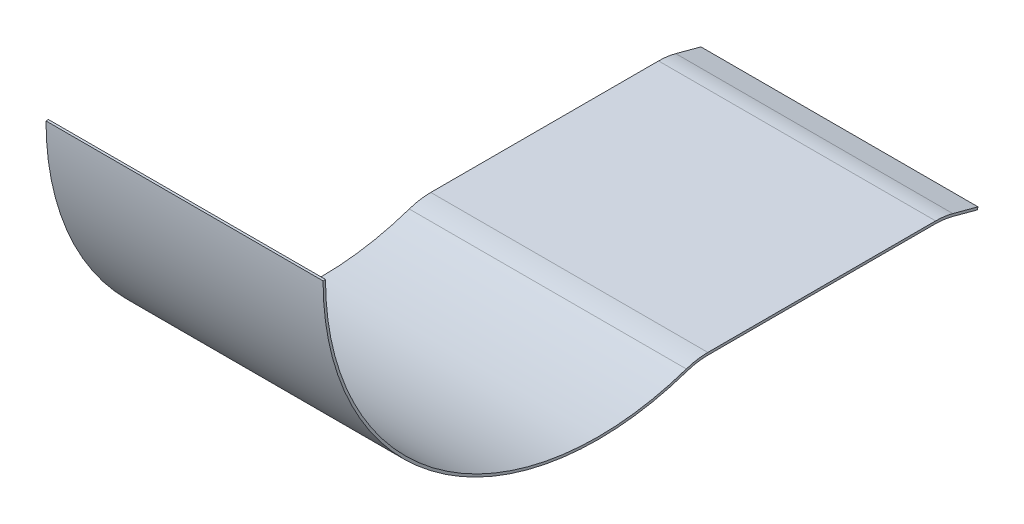
ISO-10303-21;
HEADER;
FILE_DESCRIPTION(('STEP AP214'),'2;1');
FILE_NAME('part.step','',(''),(''),'','','');
FILE_SCHEMA(('AUTOMOTIVE_DESIGN { 1 0 10303 214 1 1 1 1 }'));
ENDSEC;
DATA;
#1=APPLICATION_CONTEXT('core data for automotive mechanical design processes');
#2=APPLICATION_PROTOCOL_DEFINITION('international standard','automotive_design',2000,#1);
#3=PRODUCT_CONTEXT('',#1,'mechanical');
#4=PRODUCT('Part','Part','',(#3));
#5=PRODUCT_RELATED_PRODUCT_CATEGORY('part','',(#4));
#6=PRODUCT_DEFINITION_FORMATION('','',#4);
#7=PRODUCT_DEFINITION_CONTEXT('part definition',#1,'design');
#8=PRODUCT_DEFINITION('design','',#6,#7);
#9=PRODUCT_DEFINITION_SHAPE('','',#8);
#10=(LENGTH_UNIT() NAMED_UNIT(*) SI_UNIT(.MILLI.,.METRE.));
#11=(NAMED_UNIT(*) PLANE_ANGLE_UNIT() SI_UNIT($,.RADIAN.));
#12=(NAMED_UNIT(*) SI_UNIT($,.STERADIAN.) SOLID_ANGLE_UNIT());
#13=UNCERTAINTY_MEASURE_WITH_UNIT(LENGTH_MEASURE(1.E-05),#10,'distance_accuracy_value','');
#14=(GEOMETRIC_REPRESENTATION_CONTEXT(3) GLOBAL_UNCERTAINTY_ASSIGNED_CONTEXT((#13)) GLOBAL_UNIT_ASSIGNED_CONTEXT((#10,
#11,#12)) REPRESENTATION_CONTEXT('',''));
#15=CARTESIAN_POINT('',(0.,0.,0.));
#16=DIRECTION('',(0.,0.,1.));
#17=DIRECTION('',(1.,0.,0.));
#18=AXIS2_PLACEMENT_3D('',#15,#16,#17);
#19=CARTESIAN_POINT('',(134.9375,-156.98376546757,-636.995933716287));
#20=DIRECTION('',(0.,0.965925826289068,-0.25881904510252));
#21=DIRECTION('',(0.,0.25881904510252,0.965925826289068));
#22=AXIS2_PLACEMENT_3D('',#19,#20,#21);
#23=PLANE('',#22);
#24=DIRECTION('',(0.,-0.25881904510252,-0.965925826289068));
#25=VECTOR('',#24,1.);
#26=CARTESIAN_POINT('',(-134.9375,-156.98376546757,-636.995933716287));
#27=LINE('',#26,#25);
#28=CARTESIAN_POINT('',(-134.9375,-156.98376546757,-636.995933716287));
#29=VERTEX_POINT('',#28);
#30=CARTESIAN_POINT('',(-134.9375,-163.557769213174,-661.530449704029));
#31=VERTEX_POINT('',#30);
#32=EDGE_CURVE('E152',#29,#31,#27,.T.);
#33=ORIENTED_EDGE('',*,*,#32,.T.);
#34=DIRECTION('',(-1.,0.,0.));
#35=VECTOR('',#34,1.);
#36=CARTESIAN_POINT('',(134.9375,-163.557769213174,-661.530449704029));
#37=LINE('',#36,#35);
#38=CARTESIAN_POINT('',(134.9375,-163.557769213174,-661.530449704029));
#39=VERTEX_POINT('',#38);
#40=EDGE_CURVE('E11',#39,#31,#37,.T.);
#41=ORIENTED_EDGE('',*,*,#40,.F.);
#42=DIRECTION('',(0.,-0.25881904510252,-0.965925826289068));
#43=VECTOR('',#42,1.);
#44=CARTESIAN_POINT('',(134.9375,-156.98376546757,-636.995933716287));
#45=LINE('',#44,#43);
#46=CARTESIAN_POINT('',(134.9375,-156.98376546757,-636.995933716287));
#47=VERTEX_POINT('',#46);
#48=EDGE_CURVE('E100',#47,#39,#45,.T.);
#49=ORIENTED_EDGE('',*,*,#48,.F.);
#50=DIRECTION('',(-1.,0.,0.));
#51=VECTOR('',#50,1.);
#52=CARTESIAN_POINT('',(134.9375,-156.98376546757,-636.995933716287));
#53=LINE('',#52,#51);
#54=EDGE_CURVE('E148',#47,#29,#53,.T.);
#55=ORIENTED_EDGE('',*,*,#54,.T.);
#56=EDGE_LOOP('',(#33,#41,#49,#55));
#57=FACE_BOUND('',#56,.T.);
#58=ADVANCED_FACE('F32',(#57),#23,.F.);
#59=CARTESIAN_POINT('',(134.9375,-161.257658339323,-662.146762555179));
#60=DIRECTION('',(0.,-0.258819045102478,-0.96592582628908));
#61=DIRECTION('',(0.,0.96592582628908,-0.258819045102478));
#62=AXIS2_PLACEMENT_3D('',#59,#60,#61);
#63=PLANE('',#62);
#64=DIRECTION('',(0.,-0.96592582628908,0.258819045102478));
#65=VECTOR('',#64,1.);
#66=CARTESIAN_POINT('',(-134.9375,-161.257658339323,-662.146762555179));
#67=LINE('',#66,#65);
#68=CARTESIAN_POINT('',(-134.9375,-161.257658339323,-662.146762555179));
#69=VERTEX_POINT('',#68);
#70=EDGE_CURVE('E155',#69,#31,#67,.T.);
#71=ORIENTED_EDGE('',*,*,#70,.F.);
#72=DIRECTION('',(-1.,0.,0.));
#73=VECTOR('',#72,1.);
#74=CARTESIAN_POINT('',(134.9375,-161.257658339323,-662.146762555179));
#75=LINE('',#74,#73);
#76=CARTESIAN_POINT('',(134.9375,-161.257658339323,-662.146762555179));
#77=VERTEX_POINT('',#76);
#78=EDGE_CURVE('E40',#77,#69,#75,.T.);
#79=ORIENTED_EDGE('',*,*,#78,.F.);
#80=DIRECTION('',(0.,-0.96592582628908,0.258819045102478));
#81=VECTOR('',#80,1.);
#82=CARTESIAN_POINT('',(134.9375,-161.257658339323,-662.146762555179));
#83=LINE('',#82,#81);
#84=EDGE_CURVE('E217',#77,#39,#83,.T.);
#85=ORIENTED_EDGE('',*,*,#84,.T.);
#86=ORIENTED_EDGE('',*,*,#40,.T.);
#87=EDGE_LOOP('',(#71,#79,#85,#86));
#88=FACE_BOUND('',#87,.T.);
#89=ADVANCED_FACE('F204',(#88),#63,.T.);
#90=CARTESIAN_POINT('',(134.9375,-154.683654593719,-637.612246567437));
#91=DIRECTION('',(0.,0.965925826289068,-0.25881904510252));
#92=DIRECTION('',(0.,0.25881904510252,0.965925826289068));
#93=AXIS2_PLACEMENT_3D('',#90,#91,#92);
#94=PLANE('',#93);
#95=DIRECTION('',(0.,-0.25881904510252,-0.965925826289068));
#96=VECTOR('',#95,1.);
#97=CARTESIAN_POINT('',(-134.9375,-154.683654593719,-637.612246567437));
#98=LINE('',#97,#96);
#99=CARTESIAN_POINT('',(-134.9375,-154.683654593719,-637.612246567437));
#100=VERTEX_POINT('',#99);
#101=EDGE_CURVE('E158',#100,#69,#98,.T.);
#102=ORIENTED_EDGE('',*,*,#101,.F.);
#103=DIRECTION('',(-1.,0.,0.));
#104=VECTOR('',#103,1.);
#105=CARTESIAN_POINT('',(134.9375,-154.683654593719,-637.612246567437));
#106=LINE('',#105,#104);
#107=CARTESIAN_POINT('',(134.9375,-154.683654593719,-637.612246567437));
#108=VERTEX_POINT('',#107);
#109=EDGE_CURVE('E194',#108,#100,#106,.T.);
#110=ORIENTED_EDGE('',*,*,#109,.F.);
#111=DIRECTION('',(0.,-0.25881904510252,-0.965925826289068));
#112=VECTOR('',#111,1.);
#113=CARTESIAN_POINT('',(134.9375,-154.683654593719,-637.612246567437));
#114=LINE('',#113,#112);
#115=EDGE_CURVE('E201',#108,#77,#114,.T.);
#116=ORIENTED_EDGE('',*,*,#115,.T.);
#117=ORIENTED_EDGE('',*,*,#78,.T.);
#118=EDGE_LOOP('',(#102,#110,#116,#117));
#119=FACE_BOUND('',#118,.T.);
#120=ADVANCED_FACE('F199',(#119),#94,.T.);
#121=CARTESIAN_POINT('',(134.9375,-217.17,-620.869080777852));
#122=DIRECTION('',(-1.,0.,0.));
#123=DIRECTION('',(0.,0.,1.));
#124=AXIS2_PLACEMENT_3D('',#121,#122,#123);
#125=CYLINDRICAL_SURFACE('',#124,64.690625);
#126=CARTESIAN_POINT('',(-134.9375,-217.17,-620.869080777852));
#127=DIRECTION('',(1.,0.,0.));
#128=DIRECTION('',(0.,0.,-1.));
#129=AXIS2_PLACEMENT_3D('',#126,#127,#128);
#130=CIRCLE('',#129,64.690625);
#131=CARTESIAN_POINT('',(-134.9375,-152.479375,-620.869080777851));
#132=VERTEX_POINT('',#131);
#133=EDGE_CURVE('E161',#132,#100,#130,.F.);
#134=ORIENTED_EDGE('',*,*,#133,.F.);
#135=DIRECTION('',(-1.,0.,0.));
#136=VECTOR('',#135,1.);
#137=CARTESIAN_POINT('',(134.9375,-152.479375,-620.869080777851));
#138=LINE('',#137,#136);
#139=CARTESIAN_POINT('',(134.9375,-152.479375,-620.869080777851));
#140=VERTEX_POINT('',#139);
#141=EDGE_CURVE('E192',#140,#132,#138,.T.);
#142=ORIENTED_EDGE('',*,*,#141,.F.);
#143=CARTESIAN_POINT('',(134.9375,-217.17,-620.869080777852));
#144=DIRECTION('',(1.,0.,0.));
#145=DIRECTION('',(0.,0.,-1.));
#146=AXIS2_PLACEMENT_3D('',#143,#144,#145);
#147=CIRCLE('',#146,64.690625);
#148=EDGE_CURVE('E214',#140,#108,#147,.F.);
#149=ORIENTED_EDGE('',*,*,#148,.T.);
#150=ORIENTED_EDGE('',*,*,#109,.T.);
#151=EDGE_LOOP('',(#134,#142,#149,#150));
#152=FACE_BOUND('',#151,.T.);
#153=ADVANCED_FACE('F211',(#152),#125,.T.);
#154=CARTESIAN_POINT('',(134.9375,-152.479375,-398.991457095504));
#155=DIRECTION('',(0.,1.,0.));
#156=DIRECTION('',(0.,0.,1.));
#157=AXIS2_PLACEMENT_3D('',#154,#155,#156);
#158=PLANE('',#157);
#159=DIRECTION('',(0.,0.,-1.));
#160=VECTOR('',#159,1.);
#161=CARTESIAN_POINT('',(-134.9375,-152.479375,-398.991457095504));
#162=LINE('',#161,#160);
#163=CARTESIAN_POINT('',(-134.9375,-152.479375,-398.991457095504));
#164=VERTEX_POINT('',#163);
#165=EDGE_CURVE('E164',#164,#132,#162,.T.);
#166=ORIENTED_EDGE('',*,*,#165,.F.);
#167=DIRECTION('',(-1.,0.,0.));
#168=VECTOR('',#167,1.);
#169=CARTESIAN_POINT('',(134.9375,-152.479375,-398.991457095504));
#170=LINE('',#169,#168);
#171=CARTESIAN_POINT('',(134.9375,-152.479375,-398.991457095504));
#172=VERTEX_POINT('',#171);
#173=EDGE_CURVE('E190',#172,#164,#170,.T.);
#174=ORIENTED_EDGE('',*,*,#173,.F.);
#175=DIRECTION('',(0.,0.,-1.));
#176=VECTOR('',#175,1.);
#177=CARTESIAN_POINT('',(134.9375,-152.479375,-398.991457095504));
#178=LINE('',#177,#176);
#179=EDGE_CURVE('E219',#172,#140,#178,.T.);
#180=ORIENTED_EDGE('',*,*,#179,.T.);
#181=ORIENTED_EDGE('',*,*,#141,.T.);
#182=EDGE_LOOP('',(#166,#174,#180,#181));
#183=FACE_BOUND('',#182,.T.);
#184=ADVANCED_FACE('F319',(#183),#158,.T.);
#185=CARTESIAN_POINT('',(134.9375,-217.17,-398.991457095504));
#186=DIRECTION('',(-1.,0.,0.));
#187=DIRECTION('',(0.,0.,1.));
#188=AXIS2_PLACEMENT_3D('',#185,#186,#187);
#189=CYLINDRICAL_SURFACE('',#188,64.690625);
#190=CARTESIAN_POINT('',(-134.9375,-217.17,-398.991457095504));
#191=DIRECTION('',(1.,0.,0.));
#192=DIRECTION('',(0.,0.,-1.));
#193=AXIS2_PLACEMENT_3D('',#190,#191,#192);
#194=CIRCLE('',#193,64.690625);
#195=CARTESIAN_POINT('',(-134.9375,-155.962716346154,-378.049981727034));
#196=VERTEX_POINT('',#195);
#197=EDGE_CURVE('E167',#196,#164,#194,.F.);
#198=ORIENTED_EDGE('',*,*,#197,.F.);
#199=DIRECTION('',(-1.,0.,0.));
#200=VECTOR('',#199,1.);
#201=CARTESIAN_POINT('',(134.9375,-155.962716346154,-378.049981727034));
#202=LINE('',#201,#200);
#203=CARTESIAN_POINT('',(134.9375,-155.962716346154,-378.049981727034));
#204=VERTEX_POINT('',#203);
#205=EDGE_CURVE('E188',#204,#196,#202,.T.);
#206=ORIENTED_EDGE('',*,*,#205,.F.);
#207=CARTESIAN_POINT('',(134.9375,-217.17,-398.991457095504));
#208=DIRECTION('',(1.,0.,0.));
#209=DIRECTION('',(0.,0.,-1.));
#210=AXIS2_PLACEMENT_3D('',#207,#208,#209);
#211=CIRCLE('',#210,64.690625);
#212=EDGE_CURVE('E225',#204,#172,#211,.F.);
#213=ORIENTED_EDGE('',*,*,#212,.T.);
#214=ORIENTED_EDGE('',*,*,#173,.T.);
#215=EDGE_LOOP('',(#198,#206,#213,#214));
#216=FACE_BOUND('',#215,.T.);
#217=ADVANCED_FACE('F310',(#216),#189,.T.);
#218=CARTESIAN_POINT('',(134.9375,95.25,-292.1));
#219=DIRECTION('',(-1.,0.,0.));
#220=DIRECTION('',(0.,0.,1.));
#221=AXIS2_PLACEMENT_3D('',#218,#219,#220);
#222=CYLINDRICAL_SURFACE('',#221,265.509375);
#223=CARTESIAN_POINT('',(-134.9375,95.25,-292.1));
#224=DIRECTION('',(1.,0.,0.));
#225=DIRECTION('',(0.,0.,-1.));
#226=AXIS2_PLACEMENT_3D('',#223,#224,#225);
#227=CIRCLE('',#226,265.509375);
#228=CARTESIAN_POINT('',(-134.9375,95.25,-26.590625));
#229=VERTEX_POINT('',#228);
#230=EDGE_CURVE('E170',#229,#196,#227,.T.);
#231=ORIENTED_EDGE('',*,*,#230,.F.);
#232=DIRECTION('',(-1.,0.,0.));
#233=VECTOR('',#232,1.);
#234=CARTESIAN_POINT('',(134.9375,95.25,-26.590625));
#235=LINE('',#234,#233);
#236=CARTESIAN_POINT('',(134.9375,95.25,-26.590625));
#237=VERTEX_POINT('',#236);
#238=EDGE_CURVE('E186',#237,#229,#235,.T.);
#239=ORIENTED_EDGE('',*,*,#238,.F.);
#240=CARTESIAN_POINT('',(134.9375,95.25,-292.1));
#241=DIRECTION('',(1.,0.,0.));
#242=DIRECTION('',(0.,0.,-1.));
#243=AXIS2_PLACEMENT_3D('',#240,#241,#242);
#244=CIRCLE('',#243,265.509375);
#245=EDGE_CURVE('E228',#237,#204,#244,.T.);
#246=ORIENTED_EDGE('',*,*,#245,.T.);
#247=ORIENTED_EDGE('',*,*,#205,.T.);
#248=EDGE_LOOP('',(#231,#239,#246,#247));
#249=FACE_BOUND('',#248,.T.);
#250=ADVANCED_FACE('F240',(#249),#222,.F.);
#251=CARTESIAN_POINT('',(134.9375,95.25,-24.209375));
#252=DIRECTION('',(0.,1.,0.));
#253=DIRECTION('',(0.,0.,1.));
#254=AXIS2_PLACEMENT_3D('',#251,#252,#253);
#255=PLANE('',#254);
#256=DIRECTION('',(0.,0.,-1.));
#257=VECTOR('',#256,1.);
#258=CARTESIAN_POINT('',(-134.9375,95.25,-24.209375));
#259=LINE('',#258,#257);
#260=CARTESIAN_POINT('',(-134.9375,95.25,-24.209375));
#261=VERTEX_POINT('',#260);
#262=EDGE_CURVE('E173',#261,#229,#259,.T.);
#263=ORIENTED_EDGE('',*,*,#262,.F.);
#264=DIRECTION('',(-1.,0.,0.));
#265=VECTOR('',#264,1.);
#266=CARTESIAN_POINT('',(134.9375,95.25,-24.209375));
#267=LINE('',#266,#265);
#268=CARTESIAN_POINT('',(134.9375,95.25,-24.209375));
#269=VERTEX_POINT('',#268);
#270=EDGE_CURVE('E184',#269,#261,#267,.T.);
#271=ORIENTED_EDGE('',*,*,#270,.F.);
#272=DIRECTION('',(0.,0.,-1.));
#273=VECTOR('',#272,1.);
#274=CARTESIAN_POINT('',(134.9375,95.25,-24.209375));
#275=LINE('',#274,#273);
#276=EDGE_CURVE('E231',#269,#237,#275,.T.);
#277=ORIENTED_EDGE('',*,*,#276,.T.);
#278=ORIENTED_EDGE('',*,*,#238,.T.);
#279=EDGE_LOOP('',(#263,#271,#277,#278));
#280=FACE_BOUND('',#279,.T.);
#281=ADVANCED_FACE('F235',(#280),#255,.T.);
#282=CARTESIAN_POINT('',(134.9375,95.25,-292.1));
#283=DIRECTION('',(-1.,0.,0.));
#284=DIRECTION('',(0.,0.,1.));
#285=AXIS2_PLACEMENT_3D('',#282,#283,#284);
#286=CYLINDRICAL_SURFACE('',#285,267.890625);
#287=CARTESIAN_POINT('',(-134.9375,95.25,-292.1));
#288=DIRECTION('',(1.,0.,0.));
#289=DIRECTION('',(0.,0.,-1.));
#290=AXIS2_PLACEMENT_3D('',#287,#288,#289);
#291=CIRCLE('',#290,267.890625);
#292=CARTESIAN_POINT('',(-134.9375,-158.215745192308,-378.820833581088));
#293=VERTEX_POINT('',#292);
#294=EDGE_CURVE('E176',#261,#293,#291,.T.);
#295=ORIENTED_EDGE('',*,*,#294,.T.);
#296=DIRECTION('',(-1.,0.,0.));
#297=VECTOR('',#296,1.);
#298=CARTESIAN_POINT('',(134.9375,-158.215745192308,-378.820833581088));
#299=LINE('',#298,#297);
#300=CARTESIAN_POINT('',(134.9375,-158.215745192308,-378.820833581088));
#301=VERTEX_POINT('',#300);
#302=EDGE_CURVE('E143',#301,#293,#299,.T.);
#303=ORIENTED_EDGE('',*,*,#302,.F.);
#304=CARTESIAN_POINT('',(134.9375,95.25,-292.1));
#305=DIRECTION('',(1.,0.,0.));
#306=DIRECTION('',(0.,0.,-1.));
#307=AXIS2_PLACEMENT_3D('',#304,#305,#306);
#308=CIRCLE('',#307,267.890625);
#309=EDGE_CURVE('E134',#269,#301,#308,.T.);
#310=ORIENTED_EDGE('',*,*,#309,.F.);
#311=ORIENTED_EDGE('',*,*,#270,.T.);
#312=EDGE_LOOP('',(#295,#303,#310,#311));
#313=FACE_BOUND('',#312,.T.);
#314=ADVANCED_FACE('F244',(#313),#286,.T.);
#315=CARTESIAN_POINT('',(134.9375,-217.17,-398.991457095504));
#316=DIRECTION('',(-1.,0.,0.));
#317=DIRECTION('',(0.,0.,1.));
#318=AXIS2_PLACEMENT_3D('',#315,#316,#317);
#319=CYLINDRICAL_SURFACE('',#318,62.309375);
#320=CARTESIAN_POINT('',(-134.9375,-217.17,-398.991457095504));
#321=DIRECTION('',(1.,0.,0.));
#322=DIRECTION('',(0.,0.,-1.));
#323=AXIS2_PLACEMENT_3D('',#320,#321,#322);
#324=CIRCLE('',#323,62.309375);
#325=CARTESIAN_POINT('',(-134.9375,-154.860625,-398.991457095504));
#326=VERTEX_POINT('',#325);
#327=EDGE_CURVE('E142',#293,#326,#324,.F.);
#328=ORIENTED_EDGE('',*,*,#327,.T.);
#329=DIRECTION('',(-1.,0.,0.));
#330=VECTOR('',#329,1.);
#331=CARTESIAN_POINT('',(134.9375,-154.860625,-398.991457095504));
#332=LINE('',#331,#330);
#333=CARTESIAN_POINT('',(134.9375,-154.860625,-398.991457095504));
#334=VERTEX_POINT('',#333);
#335=EDGE_CURVE('E139',#334,#326,#332,.T.);
#336=ORIENTED_EDGE('',*,*,#335,.F.);
#337=CARTESIAN_POINT('',(134.9375,-217.17,-398.991457095504));
#338=DIRECTION('',(1.,0.,0.));
#339=DIRECTION('',(0.,0.,-1.));
#340=AXIS2_PLACEMENT_3D('',#337,#338,#339);
#341=CIRCLE('',#340,62.309375);
#342=EDGE_CURVE('E127',#301,#334,#341,.F.);
#343=ORIENTED_EDGE('',*,*,#342,.F.);
#344=ORIENTED_EDGE('',*,*,#302,.T.);
#345=EDGE_LOOP('',(#328,#336,#343,#344));
#346=FACE_BOUND('',#345,.T.);
#347=ADVANCED_FACE('F140',(#346),#319,.F.);
#348=CARTESIAN_POINT('',(134.9375,-154.860625,-398.991457095504));
#349=DIRECTION('',(0.,1.,0.));
#350=DIRECTION('',(0.,0.,1.));
#351=AXIS2_PLACEMENT_3D('',#348,#349,#350);
#352=PLANE('',#351);
#353=DIRECTION('',(0.,0.,-1.));
#354=VECTOR('',#353,1.);
#355=CARTESIAN_POINT('',(-134.9375,-154.860625,-398.991457095504));
#356=LINE('',#355,#354);
#357=CARTESIAN_POINT('',(-134.9375,-154.860625,-620.869080777851));
#358=VERTEX_POINT('',#357);
#359=EDGE_CURVE('E88',#326,#358,#356,.T.);
#360=ORIENTED_EDGE('',*,*,#359,.T.);
#361=DIRECTION('',(-1.,0.,0.));
#362=VECTOR('',#361,1.);
#363=CARTESIAN_POINT('',(134.9375,-154.860625,-620.869080777851));
#364=LINE('',#363,#362);
#365=CARTESIAN_POINT('',(134.9375,-154.860625,-620.869080777851));
#366=VERTEX_POINT('',#365);
#367=EDGE_CURVE('E144',#366,#358,#364,.T.);
#368=ORIENTED_EDGE('',*,*,#367,.F.);
#369=DIRECTION('',(0.,0.,-1.));
#370=VECTOR('',#369,1.);
#371=CARTESIAN_POINT('',(134.9375,-154.860625,-398.991457095504));
#372=LINE('',#371,#370);
#373=EDGE_CURVE('E131',#334,#366,#372,.T.);
#374=ORIENTED_EDGE('',*,*,#373,.F.);
#375=ORIENTED_EDGE('',*,*,#335,.T.);
#376=EDGE_LOOP('',(#360,#368,#374,#375));
#377=FACE_BOUND('',#376,.T.);
#378=ADVANCED_FACE('F146',(#377),#352,.F.);
#379=CARTESIAN_POINT('',(134.9375,-217.17,-620.869080777852));
#380=DIRECTION('',(-1.,0.,0.));
#381=DIRECTION('',(0.,0.,1.));
#382=AXIS2_PLACEMENT_3D('',#379,#380,#381);
#383=CYLINDRICAL_SURFACE('',#382,62.309375);
#384=CARTESIAN_POINT('',(-134.9375,-217.17,-620.869080777852));
#385=DIRECTION('',(1.,0.,0.));
#386=DIRECTION('',(0.,0.,-1.));
#387=AXIS2_PLACEMENT_3D('',#384,#385,#386);
#388=CIRCLE('',#387,62.309375);
#389=EDGE_CURVE('E94',#358,#29,#388,.F.);
#390=ORIENTED_EDGE('',*,*,#389,.T.);
#391=ORIENTED_EDGE('',*,*,#54,.F.);
#392=CARTESIAN_POINT('',(134.9375,-217.17,-620.869080777852));
#393=DIRECTION('',(1.,0.,0.));
#394=DIRECTION('',(0.,0.,-1.));
#395=AXIS2_PLACEMENT_3D('',#392,#393,#394);
#396=CIRCLE('',#395,62.309375);
#397=EDGE_CURVE('E48',#366,#47,#396,.F.);
#398=ORIENTED_EDGE('',*,*,#397,.F.);
#399=ORIENTED_EDGE('',*,*,#367,.T.);
#400=EDGE_LOOP('',(#390,#391,#398,#399));
#401=FACE_BOUND('',#400,.T.);
#402=ADVANCED_FACE('F258',(#401),#383,.F.);
#403=CARTESIAN_POINT('',(134.9375,-217.17,-620.869080777852));
#404=DIRECTION('',(1.,0.,0.));
#405=DIRECTION('',(0.,0.,-1.));
#406=AXIS2_PLACEMENT_3D('',#403,#404,#405);
#407=PLANE('',#406);
#408=ORIENTED_EDGE('',*,*,#48,.T.);
#409=ORIENTED_EDGE('',*,*,#84,.F.);
#410=ORIENTED_EDGE('',*,*,#115,.F.);
#411=ORIENTED_EDGE('',*,*,#148,.F.);
#412=ORIENTED_EDGE('',*,*,#179,.F.);
#413=ORIENTED_EDGE('',*,*,#212,.F.);
#414=ORIENTED_EDGE('',*,*,#245,.F.);
#415=ORIENTED_EDGE('',*,*,#276,.F.);
#416=ORIENTED_EDGE('',*,*,#309,.T.);
#417=ORIENTED_EDGE('',*,*,#342,.T.);
#418=ORIENTED_EDGE('',*,*,#373,.T.);
#419=ORIENTED_EDGE('',*,*,#397,.T.);
#420=EDGE_LOOP('',(#408,#409,#410,#411,#412,#413,#414,#415,#416,#417,#418,#419));
#421=FACE_BOUND('',#420,.T.);
#422=ADVANCED_FACE('F129',(#421),#407,.T.);
#423=CARTESIAN_POINT('',(-134.9375,-217.17,-620.869080777852));
#424=DIRECTION('',(1.,0.,0.));
#425=DIRECTION('',(0.,0.,-1.));
#426=AXIS2_PLACEMENT_3D('',#423,#424,#425);
#427=PLANE('',#426);
#428=ORIENTED_EDGE('',*,*,#32,.F.);
#429=ORIENTED_EDGE('',*,*,#389,.F.);
#430=ORIENTED_EDGE('',*,*,#359,.F.);
#431=ORIENTED_EDGE('',*,*,#327,.F.);
#432=ORIENTED_EDGE('',*,*,#294,.F.);
#433=ORIENTED_EDGE('',*,*,#262,.T.);
#434=ORIENTED_EDGE('',*,*,#230,.T.);
#435=ORIENTED_EDGE('',*,*,#197,.T.);
#436=ORIENTED_EDGE('',*,*,#165,.T.);
#437=ORIENTED_EDGE('',*,*,#133,.T.);
#438=ORIENTED_EDGE('',*,*,#101,.T.);
#439=ORIENTED_EDGE('',*,*,#70,.T.);
#440=EDGE_LOOP('',(#428,#429,#430,#431,#432,#433,#434,#435,#436,#437,#438,#439));
#441=FACE_BOUND('',#440,.T.);
#442=ADVANCED_FACE('F207',(#441),#427,.F.);
#443=CLOSED_SHELL('',(#58,#89,#120,#153,#184,#217,#250,#281,#314,#347,#378,#402,#422,#442));
#444=MANIFOLD_SOLID_BREP('B2',#443);
#445=ADVANCED_BREP_SHAPE_REPRESENTATION('',(#18,#444),#14);
#446=SHAPE_DEFINITION_REPRESENTATION(#9,#445);
ENDSEC;
END-ISO-10303-21;
